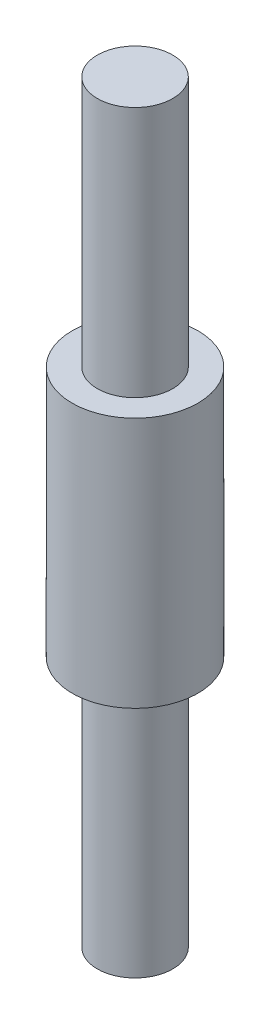
ISO-10303-21;
HEADER;
FILE_DESCRIPTION(('STEP AP214'),'2;1');
FILE_NAME('part.step','',(''),(''),'','','');
FILE_SCHEMA(('AUTOMOTIVE_DESIGN { 1 0 10303 214 1 1 1 1 }'));
ENDSEC;
DATA;
#1=APPLICATION_CONTEXT('core data for automotive mechanical design processes');
#2=APPLICATION_PROTOCOL_DEFINITION('international standard','automotive_design',2000,#1);
#3=PRODUCT_CONTEXT('',#1,'mechanical');
#4=PRODUCT('Part','Part','',(#3));
#5=PRODUCT_RELATED_PRODUCT_CATEGORY('part','',(#4));
#6=PRODUCT_DEFINITION_FORMATION('','',#4);
#7=PRODUCT_DEFINITION_CONTEXT('part definition',#1,'design');
#8=PRODUCT_DEFINITION('design','',#6,#7);
#9=PRODUCT_DEFINITION_SHAPE('','',#8);
#10=(LENGTH_UNIT() NAMED_UNIT(*) SI_UNIT(.MILLI.,.METRE.));
#11=(NAMED_UNIT(*) PLANE_ANGLE_UNIT() SI_UNIT($,.RADIAN.));
#12=(NAMED_UNIT(*) SI_UNIT($,.STERADIAN.) SOLID_ANGLE_UNIT());
#13=UNCERTAINTY_MEASURE_WITH_UNIT(LENGTH_MEASURE(1.E-05),#10,'distance_accuracy_value','');
#14=(GEOMETRIC_REPRESENTATION_CONTEXT(3) GLOBAL_UNCERTAINTY_ASSIGNED_CONTEXT((#13)) GLOBAL_UNIT_ASSIGNED_CONTEXT((#10,
#11,#12)) REPRESENTATION_CONTEXT('',''));
#15=CARTESIAN_POINT('',(0.,0.,0.));
#16=DIRECTION('',(0.,0.,1.));
#17=DIRECTION('',(1.,0.,0.));
#18=AXIS2_PLACEMENT_3D('',#15,#16,#17);
#19=CARTESIAN_POINT('',(0.,15.,0.));
#20=DIRECTION('',(0.,-1.,0.));
#21=DIRECTION('',(0.,0.,-1.));
#22=AXIS2_PLACEMENT_3D('',#19,#20,#21);
#23=CYLINDRICAL_SURFACE('',#22,2.5);
#24=CARTESIAN_POINT('',(0.,5.,0.));
#25=DIRECTION('',(0.,1.,0.));
#26=DIRECTION('',(0.,0.,1.));
#27=AXIS2_PLACEMENT_3D('',#24,#25,#26);
#28=CIRCLE('',#27,2.5);
#29=CARTESIAN_POINT('',(0.,5.,2.5));
#30=VERTEX_POINT('',#29);
#31=EDGE_CURVE('E10',#30,#30,#28,.T.);
#32=ORIENTED_EDGE('',*,*,#31,.F.);
#33=EDGE_LOOP('',(#32));
#34=FACE_BOUND('',#33,.T.);
#35=CARTESIAN_POINT('',(0.,-5.,0.));
#36=DIRECTION('',(0.,-1.,0.));
#37=DIRECTION('',(0.,0.,-1.));
#38=AXIS2_PLACEMENT_3D('',#35,#36,#37);
#39=CIRCLE('',#38,2.5);
#40=CARTESIAN_POINT('',(0.,-5.,-2.5));
#41=VERTEX_POINT('',#40);
#42=EDGE_CURVE('E36',#41,#41,#39,.T.);
#43=ORIENTED_EDGE('',*,*,#42,.F.);
#44=EDGE_LOOP('',(#43));
#45=FACE_BOUND('',#44,.T.);
#46=ADVANCED_FACE('F33',(#34,#45),#23,.T.);
#47=CARTESIAN_POINT('',(0.,5.,0.));
#48=DIRECTION('',(0.,1.,0.));
#49=DIRECTION('',(0.,0.,1.));
#50=AXIS2_PLACEMENT_3D('',#47,#48,#49);
#51=PLANE('',#50);
#52=CARTESIAN_POINT('',(0.,5.,0.));
#53=DIRECTION('',(0.,1.,0.));
#54=DIRECTION('',(0.,0.,1.));
#55=AXIS2_PLACEMENT_3D('',#52,#53,#54);
#56=CIRCLE('',#55,1.5);
#57=CARTESIAN_POINT('',(0.,5.,1.5));
#58=VERTEX_POINT('',#57);
#59=EDGE_CURVE('E40',#58,#58,#56,.T.);
#60=ORIENTED_EDGE('',*,*,#59,.F.);
#61=EDGE_LOOP('',(#60));
#62=FACE_BOUND('',#61,.T.);
#63=ORIENTED_EDGE('',*,*,#31,.T.);
#64=EDGE_LOOP('',(#63));
#65=FACE_BOUND('',#64,.T.);
#66=ADVANCED_FACE('F62',(#62,#65),#51,.T.);
#67=CARTESIAN_POINT('',(0.,5.,0.));
#68=DIRECTION('',(0.,1.,0.));
#69=DIRECTION('',(0.,0.,1.));
#70=AXIS2_PLACEMENT_3D('',#67,#68,#69);
#71=CYLINDRICAL_SURFACE('',#70,1.5);
#72=ORIENTED_EDGE('',*,*,#59,.T.);
#73=EDGE_LOOP('',(#72));
#74=FACE_BOUND('',#73,.T.);
#75=CARTESIAN_POINT('',(0.,15.,0.));
#76=DIRECTION('',(0.,1.,0.));
#77=DIRECTION('',(0.,0.,1.));
#78=AXIS2_PLACEMENT_3D('',#75,#76,#77);
#79=CIRCLE('',#78,1.5);
#80=CARTESIAN_POINT('',(0.,15.,1.5));
#81=VERTEX_POINT('',#80);
#82=EDGE_CURVE('E44',#81,#81,#79,.T.);
#83=ORIENTED_EDGE('',*,*,#82,.F.);
#84=EDGE_LOOP('',(#83));
#85=FACE_BOUND('',#84,.T.);
#86=ADVANCED_FACE('F67',(#74,#85),#71,.T.);
#87=CARTESIAN_POINT('',(0.,15.,0.));
#88=DIRECTION('',(0.,1.,0.));
#89=DIRECTION('',(0.,0.,1.));
#90=AXIS2_PLACEMENT_3D('',#87,#88,#89);
#91=PLANE('',#90);
#92=ORIENTED_EDGE('',*,*,#82,.T.);
#93=EDGE_LOOP('',(#92));
#94=FACE_BOUND('',#93,.T.);
#95=ADVANCED_FACE('F73',(#94),#91,.T.);
#96=CARTESIAN_POINT('',(0.,-5.,0.));
#97=DIRECTION('',(0.,-1.,0.));
#98=DIRECTION('',(0.,0.,1.));
#99=AXIS2_PLACEMENT_3D('',#96,#97,#98);
#100=PLANE('',#99);
#101=CARTESIAN_POINT('',(0.,-5.,0.));
#102=DIRECTION('',(0.,1.,0.));
#103=DIRECTION('',(0.,0.,1.));
#104=AXIS2_PLACEMENT_3D('',#101,#102,#103);
#105=CIRCLE('',#104,1.5);
#106=CARTESIAN_POINT('',(0.,-5.,1.5));
#107=VERTEX_POINT('',#106);
#108=EDGE_CURVE('E52',#107,#107,#105,.T.);
#109=ORIENTED_EDGE('',*,*,#108,.T.);
#110=EDGE_LOOP('',(#109));
#111=FACE_BOUND('',#110,.T.);
#112=ORIENTED_EDGE('',*,*,#42,.T.);
#113=EDGE_LOOP('',(#112));
#114=FACE_BOUND('',#113,.T.);
#115=ADVANCED_FACE('F59',(#111,#114),#100,.T.);
#116=CARTESIAN_POINT('',(0.,-5.,0.));
#117=DIRECTION('',(0.,-1.,0.));
#118=DIRECTION('',(0.,0.,-1.));
#119=AXIS2_PLACEMENT_3D('',#116,#117,#118);
#120=CYLINDRICAL_SURFACE('',#119,1.5);
#121=ORIENTED_EDGE('',*,*,#108,.F.);
#122=EDGE_LOOP('',(#121));
#123=FACE_BOUND('',#122,.T.);
#124=CARTESIAN_POINT('',(0.,-15.,0.));
#125=DIRECTION('',(0.,1.,0.));
#126=DIRECTION('',(0.,0.,1.));
#127=AXIS2_PLACEMENT_3D('',#124,#125,#126);
#128=CIRCLE('',#127,1.5);
#129=CARTESIAN_POINT('',(0.,-15.,1.5));
#130=VERTEX_POINT('',#129);
#131=EDGE_CURVE('E49',#130,#130,#128,.T.);
#132=ORIENTED_EDGE('',*,*,#131,.T.);
#133=EDGE_LOOP('',(#132));
#134=FACE_BOUND('',#133,.T.);
#135=ADVANCED_FACE('F83',(#123,#134),#120,.T.);
#136=CARTESIAN_POINT('',(0.,-15.,0.));
#137=DIRECTION('',(0.,1.,0.));
#138=DIRECTION('',(0.,0.,1.));
#139=AXIS2_PLACEMENT_3D('',#136,#137,#138);
#140=PLANE('',#139);
#141=ORIENTED_EDGE('',*,*,#131,.F.);
#142=EDGE_LOOP('',(#141));
#143=FACE_BOUND('',#142,.T.);
#144=ADVANCED_FACE('F81',(#143),#140,.F.);
#145=CLOSED_SHELL('',(#46,#66,#86,#95,#115,#135,#144));
#146=MANIFOLD_SOLID_BREP('B2',#145);
#147=ADVANCED_BREP_SHAPE_REPRESENTATION('',(#18,#146),#14);
#148=SHAPE_DEFINITION_REPRESENTATION(#9,#147);
ENDSEC;
END-ISO-10303-21;
